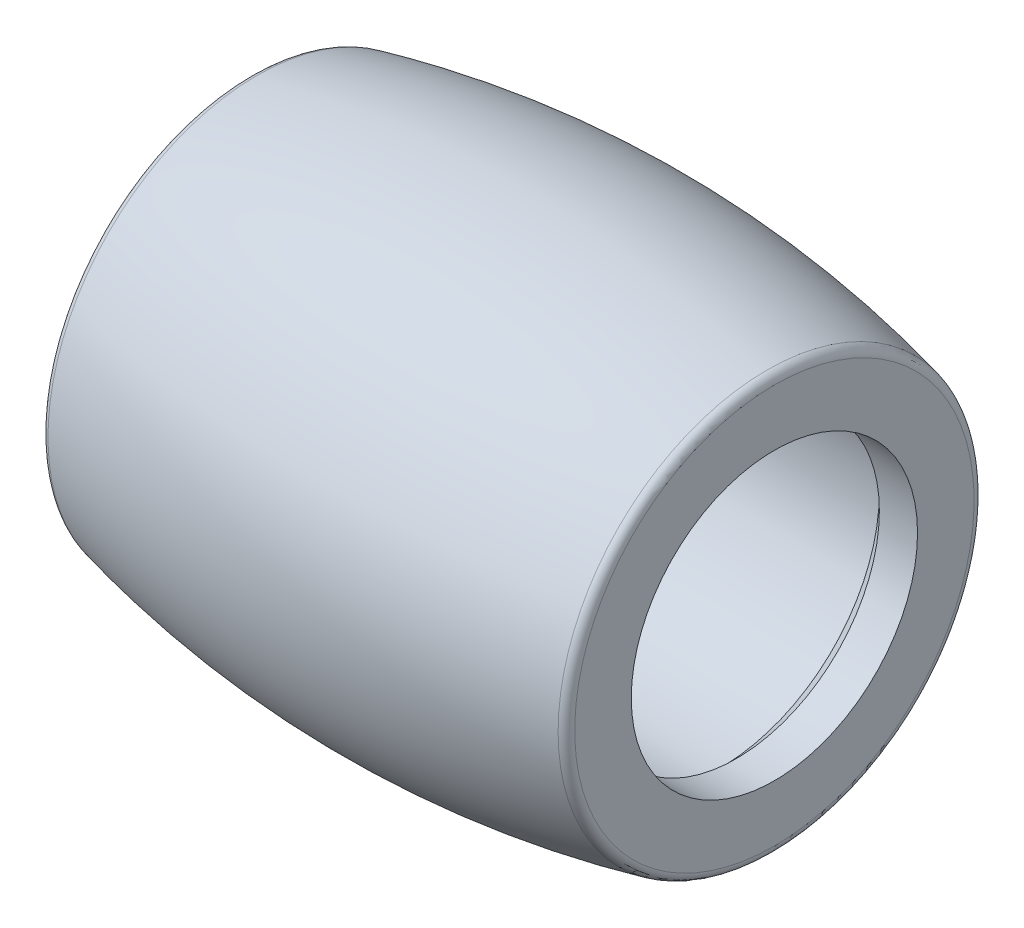
ISO-10303-21;
HEADER;
FILE_DESCRIPTION(('STEP AP214'),'2;1');
FILE_NAME('part.step','',(''),(''),'','','');
FILE_SCHEMA(('AUTOMOTIVE_DESIGN { 1 0 10303 214 1 1 1 1 }'));
ENDSEC;
DATA;
#1=APPLICATION_CONTEXT('core data for automotive mechanical design processes');
#2=APPLICATION_PROTOCOL_DEFINITION('international standard','automotive_design',2000,#1);
#3=PRODUCT_CONTEXT('',#1,'mechanical');
#4=PRODUCT('Part','Part','',(#3));
#5=PRODUCT_RELATED_PRODUCT_CATEGORY('part','',(#4));
#6=PRODUCT_DEFINITION_FORMATION('','',#4);
#7=PRODUCT_DEFINITION_CONTEXT('part definition',#1,'design');
#8=PRODUCT_DEFINITION('design','',#6,#7);
#9=PRODUCT_DEFINITION_SHAPE('','',#8);
#10=(LENGTH_UNIT() NAMED_UNIT(*) SI_UNIT(.MILLI.,.METRE.));
#11=(NAMED_UNIT(*) PLANE_ANGLE_UNIT() SI_UNIT($,.RADIAN.));
#12=(NAMED_UNIT(*) SI_UNIT($,.STERADIAN.) SOLID_ANGLE_UNIT());
#13=UNCERTAINTY_MEASURE_WITH_UNIT(LENGTH_MEASURE(1.E-05),#10,'distance_accuracy_value','');
#14=(GEOMETRIC_REPRESENTATION_CONTEXT(3) GLOBAL_UNCERTAINTY_ASSIGNED_CONTEXT((#13)) GLOBAL_UNIT_ASSIGNED_CONTEXT((#10,
#11,#12)) REPRESENTATION_CONTEXT('',''));
#15=CARTESIAN_POINT('',(0.,0.,0.));
#16=DIRECTION('',(0.,0.,1.));
#17=DIRECTION('',(1.,0.,0.));
#18=AXIS2_PLACEMENT_3D('',#15,#16,#17);
#19=CARTESIAN_POINT('',(7.95,27.5,0.));
#20=DIRECTION('',(1.,0.,0.));
#21=DIRECTION('',(0.,0.,-1.));
#22=AXIS2_PLACEMENT_3D('',#19,#20,#21);
#23=TOROIDAL_SURFACE('',#22,6.277026216054,0.3);
#24=CARTESIAN_POINT('',(8.25,27.4999988245542,1.28465216242546E-06));
#25=DIRECTION('',(-1.,0.,0.));
#26=DIRECTION('',(0.,-0.999999999999979,-2.04659401263668E-07));
#27=AXIS2_PLACEMENT_3D('',#24,#25,#26);
#28=CIRCLE('',#27,6.27702504060553);
#29=CARTESIAN_POINT('',(8.25,21.2229737839488,0.));
#30=VERTEX_POINT('',#29);
#31=CARTESIAN_POINT('',(8.25,33.7769357858698,0.0332540147563295));
#32=VERTEX_POINT('',#31);
#33=EDGE_CURVE('E69',#30,#32,#28,.T.);
#34=ORIENTED_EDGE('',*,*,#33,.T.);
#35=CARTESIAN_POINT('',(8.25,27.7495095699282,0.000236044085099164));
#36=DIRECTION('',(-1.,0.,0.));
#37=DIRECTION('',(0.,0.999984996341186,0.00547787299221315));
#38=AXIS2_PLACEMENT_3D('',#35,#36,#37);
#39=CIRCLE('',#38,6.02751665074485);
#40=CARTESIAN_POINT('',(8.25,33.7770262160512,0.));
#41=VERTEX_POINT('',#40);
#42=EDGE_CURVE('E146',#32,#41,#39,.T.);
#43=ORIENTED_EDGE('',*,*,#42,.T.);
#44=CARTESIAN_POINT('',(8.25,27.5000011787703,-2.5395195920111E-06));
#45=DIRECTION('',(1.,0.,0.));
#46=DIRECTION('',(0.,-0.999985969047149,-0.00529733034984529));
#47=AXIS2_PLACEMENT_3D('',#44,#45,#46);
#48=CIRCLE('',#47,6.2770250372814);
#49=CARTESIAN_POINT('',(8.25,21.2230642141313,-0.0332540147563215));
#50=VERTEX_POINT('',#49);
#51=EDGE_CURVE('E149',#50,#41,#48,.T.);
#52=ORIENTED_EDGE('',*,*,#51,.F.);
#53=CARTESIAN_POINT('',(8.25,27.822007803768,0.00131812694944279));
#54=DIRECTION('',(1.,0.,0.));
#55=DIRECTION('',(0.,-0.99999998005088,-0.000199745435348963));
#56=AXIS2_PLACEMENT_3D('',#53,#54,#55);
#57=CIRCLE('',#56,6.59903415146418);
#58=EDGE_CURVE('E150',#30,#50,#57,.T.);
#59=ORIENTED_EDGE('',*,*,#58,.F.);
#60=EDGE_LOOP('',(#34,#43,#52,#59));
#61=FACE_BOUND('',#60,.T.);
#62=CARTESIAN_POINT('',(8.01873198847085,27.5,3.94833905154046E-12));
#63=DIRECTION('',(-1.,0.,0.));
#64=DIRECTION('',(0.,-1.,0.));
#65=AXIS2_PLACEMENT_3D('',#62,#63,#64);
#66=CIRCLE('',#65,6.56904661561255);
#67=CARTESIAN_POINT('',(8.01873198847063,20.9309533843874,3.94833905154046E-12));
#68=VERTEX_POINT('',#67);
#69=EDGE_CURVE('E27',#68,#68,#66,.T.);
#70=ORIENTED_EDGE('',*,*,#69,.F.);
#71=EDGE_LOOP('',(#70));
#72=FACE_BOUND('',#71,.T.);
#73=ADVANCED_FACE('F16',(#61,#72),#23,.T.);
#74=CARTESIAN_POINT('',(-7.95,27.5,0.));
#75=DIRECTION('',(1.,0.,0.));
#76=DIRECTION('',(0.,0.,-1.));
#77=AXIS2_PLACEMENT_3D('',#74,#75,#76);
#78=TOROIDAL_SURFACE('',#77,6.277026216054,0.299999999999995);
#79=CARTESIAN_POINT('',(-8.01873198847086,27.5,3.91543351560553E-12));
#80=DIRECTION('',(1.,0.,0.));
#81=DIRECTION('',(0.,1.,0.));
#82=AXIS2_PLACEMENT_3D('',#79,#80,#81);
#83=CIRCLE('',#82,6.56904661561257);
#84=CARTESIAN_POINT('',(-8.01873198847108,34.0690466156125,3.91543351560553E-12));
#85=VERTEX_POINT('',#84);
#86=EDGE_CURVE('E11',#85,#85,#83,.T.);
#87=ORIENTED_EDGE('',*,*,#86,.F.);
#88=EDGE_LOOP('',(#87));
#89=FACE_BOUND('',#88,.T.);
#90=CARTESIAN_POINT('',(-8.24999999978191,27.6563357411539,0.000218505543192274));
#91=DIRECTION('',(1.,3.56309468377865E-11,1.4172978580727E-13));
#92=DIRECTION('',(-3.56309417554001E-11,0.999999999362773,-3.56994923938399E-05));
#93=AXIS2_PLACEMENT_3D('',#90,#91,#92);
#94=CIRCLE('',#93,6.12069047879712);
#95=CARTESIAN_POINT('',(-8.25,33.7770262160508,0.));
#96=VERTEX_POINT('',#95);
#97=CARTESIAN_POINT('',(-8.25,33.7768307940768,0.0491290809232914));
#98=VERTEX_POINT('',#97);
#99=EDGE_CURVE('E112',#96,#98,#94,.T.);
#100=ORIENTED_EDGE('',*,*,#99,.T.);
#101=CARTESIAN_POINT('',(-8.25,27.4999984147172,1.72914094761362E-06));
#102=DIRECTION('',(1.,0.,0.));
#103=DIRECTION('',(0.,0.999969372207395,0.00782653481102101));
#104=AXIS2_PLACEMENT_3D('',#101,#102,#103);
#105=CIRCLE('',#104,6.27702463076823);
#106=CARTESIAN_POINT('',(-8.25,21.2229737839492,0.));
#107=VERTEX_POINT('',#106);
#108=EDGE_CURVE('E119',#98,#107,#105,.T.);
#109=ORIENTED_EDGE('',*,*,#108,.T.);
#110=CARTESIAN_POINT('',(-8.25,27.3436643964435,-0.000218504871821715));
#111=DIRECTION('',(1.,0.,0.));
#112=DIRECTION('',(0.,-0.999999999362777,3.56993819003351E-05));
#113=AXIS2_PLACEMENT_3D('',#110,#111,#112);
#114=CIRCLE('',#113,6.1206906163945);
#115=CARTESIAN_POINT('',(-8.25,21.2231692059241,-0.0491290809232857));
#116=VERTEX_POINT('',#115);
#117=EDGE_CURVE('E115',#107,#116,#114,.T.);
#118=ORIENTED_EDGE('',*,*,#117,.T.);
#119=CARTESIAN_POINT('',(-8.25,27.5000015852833,-1.72913951733411E-06));
#120=DIRECTION('',(1.,0.,0.));
#121=DIRECTION('',(0.,-0.999969372207393,-0.00782653481124857));
#122=AXIS2_PLACEMENT_3D('',#119,#120,#121);
#123=CIRCLE('',#122,6.27702463076774);
#124=EDGE_CURVE('E108',#116,#96,#123,.T.);
#125=ORIENTED_EDGE('',*,*,#124,.T.);
#126=EDGE_LOOP('',(#100,#109,#118,#125));
#127=FACE_BOUND('',#126,.T.);
#128=ADVANCED_FACE('F110',(#89,#127),#78,.T.);
#129=CARTESIAN_POINT('',(0.,27.5,4.39925873507718E-12));
#130=DIRECTION('',(1.,0.,0.));
#131=DIRECTION('',(0.,-1.,0.));
#132=AXIS2_PLACEMENT_3D('',#129,#130,#131);
#133=DEGENERATE_TOROIDAL_SURFACE('',#132,27.4999999999419,34.9999999999393,.F.);
#134=ORIENTED_EDGE('',*,*,#86,.T.);
#135=EDGE_LOOP('',(#134));
#136=FACE_BOUND('',#135,.T.);
#137=ORIENTED_EDGE('',*,*,#69,.T.);
#138=EDGE_LOOP('',(#137));
#139=FACE_BOUND('',#138,.T.);
#140=ADVANCED_FACE('F161',(#136,#139),#133,.F.);
#141=CARTESIAN_POINT('',(-9.075,27.5,0.));
#142=DIRECTION('',(1.,0.,0.));
#143=DIRECTION('',(0.,0.,-1.));
#144=AXIS2_PLACEMENT_3D('',#141,#142,#143);
#145=CYLINDRICAL_SURFACE('',#144,4.5);
#146=CARTESIAN_POINT('',(7.05,27.5,0.));
#147=DIRECTION('',(1.,0.,0.));
#148=DIRECTION('',(0.,0.,-1.));
#149=AXIS2_PLACEMENT_3D('',#146,#147,#148);
#150=CIRCLE('',#149,4.5);
#151=CARTESIAN_POINT('',(7.05,27.5,-4.5));
#152=VERTEX_POINT('',#151);
#153=EDGE_CURVE('E138',#152,#152,#150,.T.);
#154=ORIENTED_EDGE('',*,*,#153,.F.);
#155=EDGE_LOOP('',(#154));
#156=FACE_BOUND('',#155,.T.);
#157=CARTESIAN_POINT('',(8.25,27.5,0.));
#158=DIRECTION('',(-1.,0.,0.));
#159=DIRECTION('',(0.,0.,-1.));
#160=AXIS2_PLACEMENT_3D('',#157,#158,#159);
#161=CIRCLE('',#160,4.5);
#162=CARTESIAN_POINT('',(8.25,27.5,-4.5));
#163=VERTEX_POINT('',#162);
#164=EDGE_CURVE('E76',#163,#163,#161,.T.);
#165=ORIENTED_EDGE('',*,*,#164,.F.);
#166=EDGE_LOOP('',(#165));
#167=FACE_BOUND('',#166,.T.);
#168=ADVANCED_FACE('F186',(#156,#167),#145,.F.);
#169=CARTESIAN_POINT('',(-9.075,27.5,0.));
#170=DIRECTION('',(1.,0.,0.));
#171=DIRECTION('',(0.,0.,-1.));
#172=AXIS2_PLACEMENT_3D('',#169,#170,#171);
#173=CYLINDRICAL_SURFACE('',#172,4.5);
#174=CARTESIAN_POINT('',(-8.25,27.5,0.));
#175=DIRECTION('',(-1.,0.,0.));
#176=DIRECTION('',(0.,0.,-1.));
#177=AXIS2_PLACEMENT_3D('',#174,#175,#176);
#178=CIRCLE('',#177,4.5);
#179=CARTESIAN_POINT('',(-8.25,27.5,-4.5));
#180=VERTEX_POINT('',#179);
#181=EDGE_CURVE('E20',#180,#180,#178,.T.);
#182=ORIENTED_EDGE('',*,*,#181,.T.);
#183=EDGE_LOOP('',(#182));
#184=FACE_BOUND('',#183,.T.);
#185=CARTESIAN_POINT('',(-7.05,27.5,0.));
#186=DIRECTION('',(-1.,0.,0.));
#187=DIRECTION('',(0.,0.,-1.));
#188=AXIS2_PLACEMENT_3D('',#185,#186,#187);
#189=CIRCLE('',#188,4.5);
#190=CARTESIAN_POINT('',(-7.05,27.5,-4.5));
#191=VERTEX_POINT('',#190);
#192=EDGE_CURVE('E131',#191,#191,#189,.T.);
#193=ORIENTED_EDGE('',*,*,#192,.F.);
#194=EDGE_LOOP('',(#193));
#195=FACE_BOUND('',#194,.T.);
#196=ADVANCED_FACE('F18',(#184,#195),#173,.F.);
#197=CARTESIAN_POINT('',(6.55000000006112,27.5,0.));
#198=DIRECTION('',(-1.,0.,0.));
#199=DIRECTION('',(0.,0.,1.));
#200=AXIS2_PLACEMENT_3D('',#197,#198,#199);
#201=CONICAL_SURFACE('',#200,4.9999999999136,0.785398163397448);
#202=ORIENTED_EDGE('',*,*,#153,.T.);
#203=EDGE_LOOP('',(#202));
#204=FACE_BOUND('',#203,.T.);
#205=CARTESIAN_POINT('',(6.55000000000427,27.5,0.));
#206=DIRECTION('',(1.,0.,0.));
#207=DIRECTION('',(0.,1.,0.));
#208=AXIS2_PLACEMENT_3D('',#205,#206,#207);
#209=CIRCLE('',#208,4.99999999997044);
#210=CARTESIAN_POINT('',(6.55000000000427,32.4999999999704,0.));
#211=VERTEX_POINT('',#210);
#212=EDGE_CURVE('E84',#211,#211,#209,.T.);
#213=ORIENTED_EDGE('',*,*,#212,.F.);
#214=EDGE_LOOP('',(#213));
#215=FACE_BOUND('',#214,.T.);
#216=ADVANCED_FACE('F182',(#204,#215),#201,.F.);
#217=CARTESIAN_POINT('',(-6.55000000011796,27.5,0.));
#218=DIRECTION('',(1.,0.,0.));
#219=DIRECTION('',(0.,0.,-1.));
#220=AXIS2_PLACEMENT_3D('',#217,#218,#219);
#221=CONICAL_SURFACE('',#220,4.99999999990678,0.785398163397448);
#222=ORIENTED_EDGE('',*,*,#192,.T.);
#223=EDGE_LOOP('',(#222));
#224=FACE_BOUND('',#223,.T.);
#225=CARTESIAN_POINT('',(-6.55000000006112,27.5,0.));
#226=DIRECTION('',(-1.,0.,0.));
#227=DIRECTION('',(0.,-1.,0.));
#228=AXIS2_PLACEMENT_3D('',#225,#226,#227);
#229=CIRCLE('',#228,4.99999999996362);
#230=CARTESIAN_POINT('',(-6.55000000006112,22.5000000000364,0.));
#231=VERTEX_POINT('',#230);
#232=EDGE_CURVE('E129',#231,#231,#229,.T.);
#233=ORIENTED_EDGE('',*,*,#232,.F.);
#234=EDGE_LOOP('',(#233));
#235=FACE_BOUND('',#234,.T.);
#236=ADVANCED_FACE('F179',(#224,#235),#221,.F.);
#237=CARTESIAN_POINT('',(-9.075,27.5,0.));
#238=DIRECTION('',(1.,0.,0.));
#239=DIRECTION('',(0.,0.,-1.));
#240=AXIS2_PLACEMENT_3D('',#237,#238,#239);
#241=CYLINDRICAL_SURFACE('',#240,5.);
#242=ORIENTED_EDGE('',*,*,#232,.T.);
#243=EDGE_LOOP('',(#242));
#244=FACE_BOUND('',#243,.T.);
#245=ORIENTED_EDGE('',*,*,#212,.T.);
#246=EDGE_LOOP('',(#245));
#247=FACE_BOUND('',#246,.T.);
#248=ADVANCED_FACE('F176',(#244,#247),#241,.F.);
#249=CARTESIAN_POINT('',(8.25,27.5,0.));
#250=DIRECTION('',(1.,0.,0.));
#251=DIRECTION('',(0.,1.,0.));
#252=AXIS2_PLACEMENT_3D('',#249,#250,#251);
#253=PLANE('',#252);
#254=ORIENTED_EDGE('',*,*,#164,.T.);
#255=EDGE_LOOP('',(#254));
#256=FACE_BOUND('',#255,.T.);
#257=ORIENTED_EDGE('',*,*,#58,.T.);
#258=ORIENTED_EDGE('',*,*,#51,.T.);
#259=ORIENTED_EDGE('',*,*,#42,.F.);
#260=ORIENTED_EDGE('',*,*,#33,.F.);
#261=EDGE_LOOP('',(#257,#258,#259,#260));
#262=FACE_BOUND('',#261,.T.);
#263=ADVANCED_FACE('F173',(#256,#262),#253,.T.);
#264=CARTESIAN_POINT('',(-8.25,27.5,0.));
#265=DIRECTION('',(1.,0.,0.));
#266=DIRECTION('',(0.,1.,0.));
#267=AXIS2_PLACEMENT_3D('',#264,#265,#266);
#268=PLANE('',#267);
#269=ORIENTED_EDGE('',*,*,#181,.F.);
#270=EDGE_LOOP('',(#269));
#271=FACE_BOUND('',#270,.T.);
#272=ORIENTED_EDGE('',*,*,#117,.F.);
#273=ORIENTED_EDGE('',*,*,#108,.F.);
#274=ORIENTED_EDGE('',*,*,#99,.F.);
#275=ORIENTED_EDGE('',*,*,#124,.F.);
#276=EDGE_LOOP('',(#272,#273,#274,#275));
#277=FACE_BOUND('',#276,.T.);
#278=ADVANCED_FACE('F118',(#271,#277),#268,.F.);
#279=CLOSED_SHELL('',(#73,#128,#140,#168,#196,#216,#236,#248,#263,#278));
#280=MANIFOLD_SOLID_BREP('B1',#279);
#281=ADVANCED_BREP_SHAPE_REPRESENTATION('',(#18,#280),#14);
#282=SHAPE_DEFINITION_REPRESENTATION(#9,#281);
ENDSEC;
END-ISO-10303-21;
